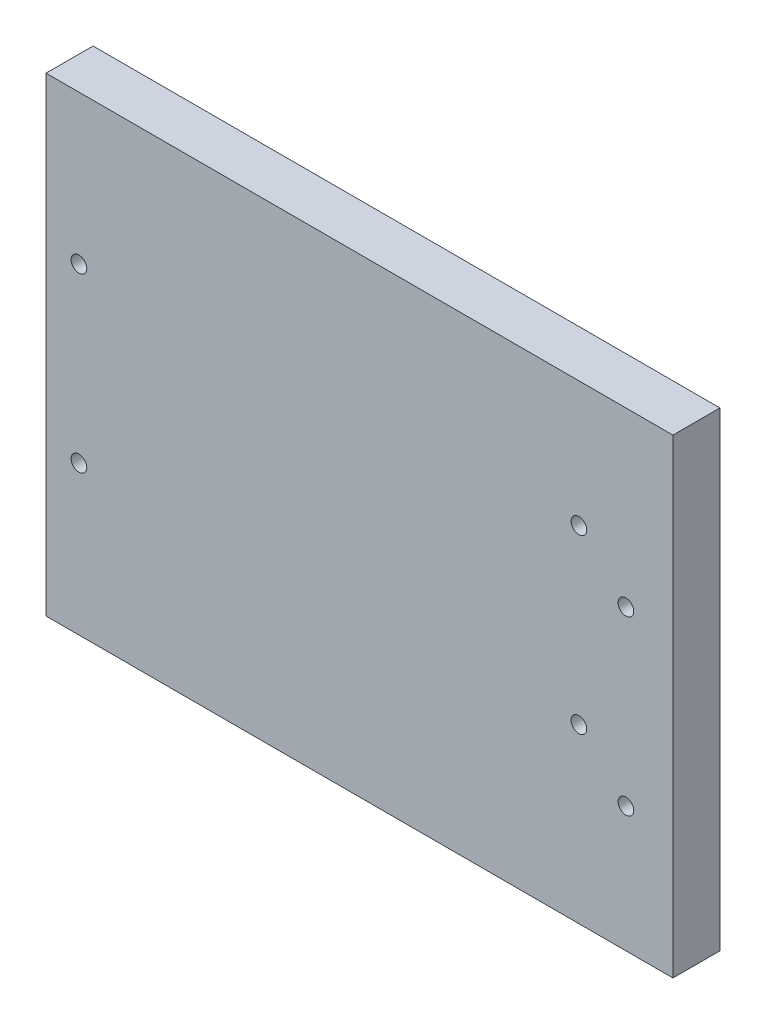
ISO-10303-21;
HEADER;
FILE_DESCRIPTION(('STEP AP214'),'2;1');
FILE_NAME('part.step','',(''),(''),'','','');
FILE_SCHEMA(('AUTOMOTIVE_DESIGN { 1 0 10303 214 1 1 1 1 }'));
ENDSEC;
DATA;
#1=APPLICATION_CONTEXT('core data for automotive mechanical design processes');
#2=APPLICATION_PROTOCOL_DEFINITION('international standard','automotive_design',2000,#1);
#3=PRODUCT_CONTEXT('',#1,'mechanical');
#4=PRODUCT('Part','Part','',(#3));
#5=PRODUCT_RELATED_PRODUCT_CATEGORY('part','',(#4));
#6=PRODUCT_DEFINITION_FORMATION('','',#4);
#7=PRODUCT_DEFINITION_CONTEXT('part definition',#1,'design');
#8=PRODUCT_DEFINITION('design','',#6,#7);
#9=PRODUCT_DEFINITION_SHAPE('','',#8);
#10=(LENGTH_UNIT() NAMED_UNIT(*) SI_UNIT(.MILLI.,.METRE.));
#11=(NAMED_UNIT(*) PLANE_ANGLE_UNIT() SI_UNIT($,.RADIAN.));
#12=(NAMED_UNIT(*) SI_UNIT($,.STERADIAN.) SOLID_ANGLE_UNIT());
#13=UNCERTAINTY_MEASURE_WITH_UNIT(LENGTH_MEASURE(1.E-05),#10,'distance_accuracy_value','');
#14=(GEOMETRIC_REPRESENTATION_CONTEXT(3) GLOBAL_UNCERTAINTY_ASSIGNED_CONTEXT((#13)) GLOBAL_UNIT_ASSIGNED_CONTEXT((#10,
#11,#12)) REPRESENTATION_CONTEXT('',''));
#15=CARTESIAN_POINT('',(0.,0.,0.));
#16=DIRECTION('',(0.,0.,1.));
#17=DIRECTION('',(1.,0.,0.));
#18=AXIS2_PLACEMENT_3D('',#15,#16,#17);
#19=CARTESIAN_POINT('',(-89.5,-27.5,0.));
#20=DIRECTION('',(0.,0.,1.));
#21=DIRECTION('',(1.,0.,0.));
#22=AXIS2_PLACEMENT_3D('',#19,#20,#21);
#23=CYLINDRICAL_SURFACE('',#22,2.50000000000001);
#24=CARTESIAN_POINT('',(-89.5,-27.5,15.));
#25=DIRECTION('',(0.,0.,1.));
#26=DIRECTION('',(1.,0.,0.));
#27=AXIS2_PLACEMENT_3D('',#24,#25,#26);
#28=CIRCLE('',#27,2.50000000000001);
#29=CARTESIAN_POINT('',(-87.,-27.5,15.));
#30=VERTEX_POINT('',#29);
#31=EDGE_CURVE('E154',#30,#30,#28,.T.);
#32=ORIENTED_EDGE('',*,*,#31,.T.);
#33=EDGE_LOOP('',(#32));
#34=FACE_BOUND('',#33,.T.);
#35=CARTESIAN_POINT('',(-89.5,-27.5,6.));
#36=DIRECTION('',(0.,0.,-1.));
#37=DIRECTION('',(-1.,0.,0.));
#38=AXIS2_PLACEMENT_3D('',#35,#36,#37);
#39=CIRCLE('',#38,2.50000000000001);
#40=CARTESIAN_POINT('',(-92.,-27.5,6.));
#41=VERTEX_POINT('',#40);
#42=EDGE_CURVE('E48',#41,#41,#39,.F.);
#43=ORIENTED_EDGE('',*,*,#42,.F.);
#44=EDGE_LOOP('',(#43));
#45=FACE_BOUND('',#44,.T.);
#46=ADVANCED_FACE('F44',(#34,#45),#23,.F.);
#47=CARTESIAN_POINT('',(-89.5,27.5,0.));
#48=DIRECTION('',(0.,0.,1.));
#49=DIRECTION('',(1.,0.,0.));
#50=AXIS2_PLACEMENT_3D('',#47,#48,#49);
#51=CYLINDRICAL_SURFACE('',#50,2.50000000000001);
#52=CARTESIAN_POINT('',(-89.5,27.5,15.));
#53=DIRECTION('',(0.,0.,1.));
#54=DIRECTION('',(1.,0.,0.));
#55=AXIS2_PLACEMENT_3D('',#52,#53,#54);
#56=CIRCLE('',#55,2.50000000000001);
#57=CARTESIAN_POINT('',(-87.,27.5,15.));
#58=VERTEX_POINT('',#57);
#59=EDGE_CURVE('E159',#58,#58,#56,.T.);
#60=ORIENTED_EDGE('',*,*,#59,.T.);
#61=EDGE_LOOP('',(#60));
#62=FACE_BOUND('',#61,.T.);
#63=CARTESIAN_POINT('',(-89.5,27.5,6.));
#64=DIRECTION('',(0.,0.,-1.));
#65=DIRECTION('',(-1.,0.,0.));
#66=AXIS2_PLACEMENT_3D('',#63,#64,#65);
#67=CIRCLE('',#66,2.50000000000001);
#68=CARTESIAN_POINT('',(-92.,27.5,6.));
#69=VERTEX_POINT('',#68);
#70=EDGE_CURVE('E147',#69,#69,#67,.F.);
#71=ORIENTED_EDGE('',*,*,#70,.F.);
#72=EDGE_LOOP('',(#71));
#73=FACE_BOUND('',#72,.T.);
#74=ADVANCED_FACE('F257',(#62,#73),#51,.F.);
#75=CARTESIAN_POINT('',(70.,35.,0.));
#76=DIRECTION('',(0.,0.,1.));
#77=DIRECTION('',(1.,0.,0.));
#78=AXIS2_PLACEMENT_3D('',#75,#76,#77);
#79=CYLINDRICAL_SURFACE('',#78,2.5);
#80=CARTESIAN_POINT('',(70.,35.,15.));
#81=DIRECTION('',(0.,0.,1.));
#82=DIRECTION('',(1.,0.,0.));
#83=AXIS2_PLACEMENT_3D('',#80,#81,#82);
#84=CIRCLE('',#83,2.5);
#85=CARTESIAN_POINT('',(72.5,35.,15.));
#86=VERTEX_POINT('',#85);
#87=EDGE_CURVE('E165',#86,#86,#84,.T.);
#88=ORIENTED_EDGE('',*,*,#87,.T.);
#89=EDGE_LOOP('',(#88));
#90=FACE_BOUND('',#89,.T.);
#91=CARTESIAN_POINT('',(70.,35.,6.));
#92=DIRECTION('',(0.,0.,-1.));
#93=DIRECTION('',(-1.,0.,0.));
#94=AXIS2_PLACEMENT_3D('',#91,#92,#93);
#95=CIRCLE('',#94,2.5);
#96=CARTESIAN_POINT('',(67.5,35.,6.));
#97=VERTEX_POINT('',#96);
#98=EDGE_CURVE('E144',#97,#97,#95,.F.);
#99=ORIENTED_EDGE('',*,*,#98,.F.);
#100=EDGE_LOOP('',(#99));
#101=FACE_BOUND('',#100,.T.);
#102=ADVANCED_FACE('F263',(#90,#101),#79,.F.);
#103=CARTESIAN_POINT('',(85.,20.,0.));
#104=DIRECTION('',(0.,0.,1.));
#105=DIRECTION('',(1.,0.,0.));
#106=AXIS2_PLACEMENT_3D('',#103,#104,#105);
#107=CYLINDRICAL_SURFACE('',#106,2.50000000000001);
#108=CARTESIAN_POINT('',(85.,20.,15.));
#109=DIRECTION('',(0.,0.,1.));
#110=DIRECTION('',(1.,0.,0.));
#111=AXIS2_PLACEMENT_3D('',#108,#109,#110);
#112=CIRCLE('',#111,2.50000000000001);
#113=CARTESIAN_POINT('',(87.5,20.,15.));
#114=VERTEX_POINT('',#113);
#115=EDGE_CURVE('E176',#114,#114,#112,.T.);
#116=ORIENTED_EDGE('',*,*,#115,.T.);
#117=EDGE_LOOP('',(#116));
#118=FACE_BOUND('',#117,.T.);
#119=CARTESIAN_POINT('',(85.,20.,6.));
#120=DIRECTION('',(0.,0.,-1.));
#121=DIRECTION('',(-1.,0.,0.));
#122=AXIS2_PLACEMENT_3D('',#119,#120,#121);
#123=CIRCLE('',#122,2.50000000000001);
#124=CARTESIAN_POINT('',(82.5,20.,6.));
#125=VERTEX_POINT('',#124);
#126=EDGE_CURVE('E140',#125,#125,#123,.F.);
#127=ORIENTED_EDGE('',*,*,#126,.F.);
#128=EDGE_LOOP('',(#127));
#129=FACE_BOUND('',#128,.T.);
#130=ADVANCED_FACE('F270',(#118,#129),#107,.F.);
#131=CARTESIAN_POINT('',(70.,-20.,0.));
#132=DIRECTION('',(0.,0.,1.));
#133=DIRECTION('',(1.,0.,0.));
#134=AXIS2_PLACEMENT_3D('',#131,#132,#133);
#135=CYLINDRICAL_SURFACE('',#134,2.5);
#136=CARTESIAN_POINT('',(70.,-20.,15.));
#137=DIRECTION('',(0.,0.,1.));
#138=DIRECTION('',(1.,0.,0.));
#139=AXIS2_PLACEMENT_3D('',#136,#137,#138);
#140=CIRCLE('',#139,2.5);
#141=CARTESIAN_POINT('',(72.5,-20.,15.));
#142=VERTEX_POINT('',#141);
#143=EDGE_CURVE('E172',#142,#142,#140,.T.);
#144=ORIENTED_EDGE('',*,*,#143,.T.);
#145=EDGE_LOOP('',(#144));
#146=FACE_BOUND('',#145,.T.);
#147=CARTESIAN_POINT('',(70.,-20.,6.));
#148=DIRECTION('',(0.,0.,-1.));
#149=DIRECTION('',(-1.,0.,0.));
#150=AXIS2_PLACEMENT_3D('',#147,#148,#149);
#151=CIRCLE('',#150,2.5);
#152=CARTESIAN_POINT('',(67.5,-20.,6.));
#153=VERTEX_POINT('',#152);
#154=EDGE_CURVE('E135',#153,#153,#151,.F.);
#155=ORIENTED_EDGE('',*,*,#154,.F.);
#156=EDGE_LOOP('',(#155));
#157=FACE_BOUND('',#156,.T.);
#158=ADVANCED_FACE('F273',(#146,#157),#135,.F.);
#159=CARTESIAN_POINT('',(85.,-35.,0.));
#160=DIRECTION('',(0.,0.,1.));
#161=DIRECTION('',(1.,0.,0.));
#162=AXIS2_PLACEMENT_3D('',#159,#160,#161);
#163=CYLINDRICAL_SURFACE('',#162,2.50000000000001);
#164=CARTESIAN_POINT('',(85.,-35.,15.));
#165=DIRECTION('',(0.,0.,1.));
#166=DIRECTION('',(1.,0.,0.));
#167=AXIS2_PLACEMENT_3D('',#164,#165,#166);
#168=CIRCLE('',#167,2.50000000000001);
#169=CARTESIAN_POINT('',(87.5,-35.,15.));
#170=VERTEX_POINT('',#169);
#171=EDGE_CURVE('E120',#170,#170,#168,.T.);
#172=ORIENTED_EDGE('',*,*,#171,.T.);
#173=EDGE_LOOP('',(#172));
#174=FACE_BOUND('',#173,.T.);
#175=CARTESIAN_POINT('',(85.,-35.,6.));
#176=DIRECTION('',(0.,0.,-1.));
#177=DIRECTION('',(-1.,0.,0.));
#178=AXIS2_PLACEMENT_3D('',#175,#176,#177);
#179=CIRCLE('',#178,2.50000000000001);
#180=CARTESIAN_POINT('',(82.5,-35.,6.));
#181=VERTEX_POINT('',#180);
#182=EDGE_CURVE('E131',#181,#181,#179,.F.);
#183=ORIENTED_EDGE('',*,*,#182,.F.);
#184=EDGE_LOOP('',(#183));
#185=FACE_BOUND('',#184,.T.);
#186=ADVANCED_FACE('F277',(#174,#185),#163,.F.);
#187=CARTESIAN_POINT('',(-100.,-75.,15.));
#188=DIRECTION('',(1.,0.,0.));
#189=DIRECTION('',(0.,0.,-1.));
#190=AXIS2_PLACEMENT_3D('',#187,#188,#189);
#191=PLANE('',#190);
#192=DIRECTION('',(0.,-1.,0.));
#193=VECTOR('',#192,1.);
#194=CARTESIAN_POINT('',(-100.,-75.,0.));
#195=LINE('',#194,#193);
#196=CARTESIAN_POINT('',(-100.,75.,0.));
#197=VERTEX_POINT('',#196);
#198=CARTESIAN_POINT('',(-100.,-75.,0.));
#199=VERTEX_POINT('',#198);
#200=EDGE_CURVE('E116',#197,#199,#195,.T.);
#201=ORIENTED_EDGE('',*,*,#200,.T.);
#202=DIRECTION('',(0.,0.,-1.));
#203=VECTOR('',#202,1.);
#204=CARTESIAN_POINT('',(-100.,-75.,15.));
#205=LINE('',#204,#203);
#206=CARTESIAN_POINT('',(-100.,-75.,15.));
#207=VERTEX_POINT('',#206);
#208=EDGE_CURVE('E11',#207,#199,#205,.T.);
#209=ORIENTED_EDGE('',*,*,#208,.F.);
#210=DIRECTION('',(0.,-1.,0.));
#211=VECTOR('',#210,1.);
#212=CARTESIAN_POINT('',(-100.,-75.,15.));
#213=LINE('',#212,#211);
#214=CARTESIAN_POINT('',(-100.,75.,15.));
#215=VERTEX_POINT('',#214);
#216=EDGE_CURVE('E99',#215,#207,#213,.T.);
#217=ORIENTED_EDGE('',*,*,#216,.F.);
#218=DIRECTION('',(0.,0.,-1.));
#219=VECTOR('',#218,1.);
#220=CARTESIAN_POINT('',(-100.,75.,15.));
#221=LINE('',#220,#219);
#222=EDGE_CURVE('E112',#215,#197,#221,.T.);
#223=ORIENTED_EDGE('',*,*,#222,.T.);
#224=EDGE_LOOP('',(#201,#209,#217,#223));
#225=FACE_BOUND('',#224,.T.);
#226=ADVANCED_FACE('F46',(#225),#191,.F.);
#227=CARTESIAN_POINT('',(100.,-75.,15.));
#228=DIRECTION('',(0.,1.,0.));
#229=DIRECTION('',(-1.,0.,0.));
#230=AXIS2_PLACEMENT_3D('',#227,#228,#229);
#231=PLANE('',#230);
#232=DIRECTION('',(1.,0.,0.));
#233=VECTOR('',#232,1.);
#234=CARTESIAN_POINT('',(100.,-75.,0.));
#235=LINE('',#234,#233);
#236=CARTESIAN_POINT('',(100.,-75.,0.));
#237=VERTEX_POINT('',#236);
#238=EDGE_CURVE('E104',#199,#237,#235,.T.);
#239=ORIENTED_EDGE('',*,*,#238,.T.);
#240=DIRECTION('',(0.,0.,-1.));
#241=VECTOR('',#240,1.);
#242=CARTESIAN_POINT('',(100.,-75.,15.));
#243=LINE('',#242,#241);
#244=CARTESIAN_POINT('',(100.,-75.,15.));
#245=VERTEX_POINT('',#244);
#246=EDGE_CURVE('E55',#245,#237,#243,.T.);
#247=ORIENTED_EDGE('',*,*,#246,.F.);
#248=DIRECTION('',(1.,0.,0.));
#249=VECTOR('',#248,1.);
#250=CARTESIAN_POINT('',(100.,-75.,15.));
#251=LINE('',#250,#249);
#252=EDGE_CURVE('E94',#207,#245,#251,.T.);
#253=ORIENTED_EDGE('',*,*,#252,.F.);
#254=ORIENTED_EDGE('',*,*,#208,.T.);
#255=EDGE_LOOP('',(#239,#247,#253,#254));
#256=FACE_BOUND('',#255,.T.);
#257=ADVANCED_FACE('F103',(#256),#231,.F.);
#258=CARTESIAN_POINT('',(100.,-75.,15.));
#259=DIRECTION('',(-1.,0.,0.));
#260=DIRECTION('',(0.,0.,1.));
#261=AXIS2_PLACEMENT_3D('',#258,#259,#260);
#262=PLANE('',#261);
#263=DIRECTION('',(0.,1.,0.));
#264=VECTOR('',#263,1.);
#265=CARTESIAN_POINT('',(100.,-75.,0.));
#266=LINE('',#265,#264);
#267=CARTESIAN_POINT('',(100.,75.,0.));
#268=VERTEX_POINT('',#267);
#269=EDGE_CURVE('E81',#237,#268,#266,.T.);
#270=ORIENTED_EDGE('',*,*,#269,.T.);
#271=DIRECTION('',(0.,0.,-1.));
#272=VECTOR('',#271,1.);
#273=CARTESIAN_POINT('',(100.,75.,15.));
#274=LINE('',#273,#272);
#275=CARTESIAN_POINT('',(100.,75.,15.));
#276=VERTEX_POINT('',#275);
#277=EDGE_CURVE('E106',#276,#268,#274,.T.);
#278=ORIENTED_EDGE('',*,*,#277,.F.);
#279=DIRECTION('',(0.,1.,0.));
#280=VECTOR('',#279,1.);
#281=CARTESIAN_POINT('',(100.,-75.,15.));
#282=LINE('',#281,#280);
#283=EDGE_CURVE('E97',#245,#276,#282,.T.);
#284=ORIENTED_EDGE('',*,*,#283,.F.);
#285=ORIENTED_EDGE('',*,*,#246,.T.);
#286=EDGE_LOOP('',(#270,#278,#284,#285));
#287=FACE_BOUND('',#286,.T.);
#288=ADVANCED_FACE('F108',(#287),#262,.F.);
#289=CARTESIAN_POINT('',(100.,75.,15.));
#290=DIRECTION('',(0.,-1.,0.));
#291=DIRECTION('',(1.,0.,0.));
#292=AXIS2_PLACEMENT_3D('',#289,#290,#291);
#293=PLANE('',#292);
#294=DIRECTION('',(-1.,0.,0.));
#295=VECTOR('',#294,1.);
#296=CARTESIAN_POINT('',(100.,75.,0.));
#297=LINE('',#296,#295);
#298=EDGE_CURVE('E87',#268,#197,#297,.T.);
#299=ORIENTED_EDGE('',*,*,#298,.T.);
#300=ORIENTED_EDGE('',*,*,#222,.F.);
#301=DIRECTION('',(-1.,0.,0.));
#302=VECTOR('',#301,1.);
#303=CARTESIAN_POINT('',(100.,75.,15.));
#304=LINE('',#303,#302);
#305=EDGE_CURVE('E64',#276,#215,#304,.T.);
#306=ORIENTED_EDGE('',*,*,#305,.F.);
#307=ORIENTED_EDGE('',*,*,#277,.T.);
#308=EDGE_LOOP('',(#299,#300,#306,#307));
#309=FACE_BOUND('',#308,.T.);
#310=ADVANCED_FACE('F245',(#309),#293,.F.);
#311=CARTESIAN_POINT('',(0.,0.,15.));
#312=DIRECTION('',(0.,0.,1.));
#313=DIRECTION('',(1.,0.,0.));
#314=AXIS2_PLACEMENT_3D('',#311,#312,#313);
#315=PLANE('',#314);
#316=ORIENTED_EDGE('',*,*,#171,.F.);
#317=EDGE_LOOP('',(#316));
#318=FACE_BOUND('',#317,.T.);
#319=ORIENTED_EDGE('',*,*,#143,.F.);
#320=EDGE_LOOP('',(#319));
#321=FACE_BOUND('',#320,.T.);
#322=ORIENTED_EDGE('',*,*,#115,.F.);
#323=EDGE_LOOP('',(#322));
#324=FACE_BOUND('',#323,.T.);
#325=ORIENTED_EDGE('',*,*,#87,.F.);
#326=EDGE_LOOP('',(#325));
#327=FACE_BOUND('',#326,.T.);
#328=ORIENTED_EDGE('',*,*,#59,.F.);
#329=EDGE_LOOP('',(#328));
#330=FACE_BOUND('',#329,.T.);
#331=ORIENTED_EDGE('',*,*,#31,.F.);
#332=EDGE_LOOP('',(#331));
#333=FACE_BOUND('',#332,.T.);
#334=ORIENTED_EDGE('',*,*,#216,.T.);
#335=ORIENTED_EDGE('',*,*,#252,.T.);
#336=ORIENTED_EDGE('',*,*,#283,.T.);
#337=ORIENTED_EDGE('',*,*,#305,.T.);
#338=EDGE_LOOP('',(#334,#335,#336,#337));
#339=FACE_BOUND('',#338,.T.);
#340=ADVANCED_FACE('F95',(#318,#321,#324,#327,#330,#333,#339),#315,.T.);
#341=CARTESIAN_POINT('',(0.,0.,0.));
#342=DIRECTION('',(0.,0.,1.));
#343=DIRECTION('',(1.,0.,0.));
#344=AXIS2_PLACEMENT_3D('',#341,#342,#343);
#345=PLANE('',#344);
#346=CARTESIAN_POINT('',(-89.5,-27.5,0.));
#347=DIRECTION('',(0.,0.,-1.));
#348=DIRECTION('',(-1.,0.,0.));
#349=AXIS2_PLACEMENT_3D('',#346,#347,#348);
#350=CIRCLE('',#349,5.);
#351=CARTESIAN_POINT('',(-94.5,-27.5,0.));
#352=VERTEX_POINT('',#351);
#353=EDGE_CURVE('E213',#352,#352,#350,.T.);
#354=ORIENTED_EDGE('',*,*,#353,.F.);
#355=EDGE_LOOP('',(#354));
#356=FACE_BOUND('',#355,.T.);
#357=CARTESIAN_POINT('',(85.,-35.,0.));
#358=DIRECTION('',(0.,0.,-1.));
#359=DIRECTION('',(-1.,0.,0.));
#360=AXIS2_PLACEMENT_3D('',#357,#358,#359);
#361=CIRCLE('',#360,5.00000000000001);
#362=CARTESIAN_POINT('',(80.,-35.,0.));
#363=VERTEX_POINT('',#362);
#364=EDGE_CURVE('E198',#363,#363,#361,.T.);
#365=ORIENTED_EDGE('',*,*,#364,.F.);
#366=EDGE_LOOP('',(#365));
#367=FACE_BOUND('',#366,.T.);
#368=CARTESIAN_POINT('',(85.,20.,0.));
#369=DIRECTION('',(0.,0.,-1.));
#370=DIRECTION('',(-1.,0.,0.));
#371=AXIS2_PLACEMENT_3D('',#368,#369,#370);
#372=CIRCLE('',#371,5.);
#373=CARTESIAN_POINT('',(80.,20.,0.));
#374=VERTEX_POINT('',#373);
#375=EDGE_CURVE('E197',#374,#374,#372,.T.);
#376=ORIENTED_EDGE('',*,*,#375,.F.);
#377=EDGE_LOOP('',(#376));
#378=FACE_BOUND('',#377,.T.);
#379=CARTESIAN_POINT('',(70.,-20.,0.));
#380=DIRECTION('',(0.,0.,-1.));
#381=DIRECTION('',(-1.,0.,0.));
#382=AXIS2_PLACEMENT_3D('',#379,#380,#381);
#383=CIRCLE('',#382,5.);
#384=CARTESIAN_POINT('',(65.,-20.,0.));
#385=VERTEX_POINT('',#384);
#386=EDGE_CURVE('E189',#385,#385,#383,.T.);
#387=ORIENTED_EDGE('',*,*,#386,.F.);
#388=EDGE_LOOP('',(#387));
#389=FACE_BOUND('',#388,.T.);
#390=CARTESIAN_POINT('',(-89.5,27.5,0.));
#391=DIRECTION('',(0.,0.,-1.));
#392=DIRECTION('',(-1.,0.,0.));
#393=AXIS2_PLACEMENT_3D('',#390,#391,#392);
#394=CIRCLE('',#393,5.);
#395=CARTESIAN_POINT('',(-94.5,27.5,0.));
#396=VERTEX_POINT('',#395);
#397=EDGE_CURVE('E214',#396,#396,#394,.T.);
#398=ORIENTED_EDGE('',*,*,#397,.F.);
#399=EDGE_LOOP('',(#398));
#400=FACE_BOUND('',#399,.T.);
#401=CARTESIAN_POINT('',(70.,35.,0.));
#402=DIRECTION('',(0.,0.,-1.));
#403=DIRECTION('',(-1.,0.,0.));
#404=AXIS2_PLACEMENT_3D('',#401,#402,#403);
#405=CIRCLE('',#404,4.99999999999999);
#406=CARTESIAN_POINT('',(65.,35.,0.));
#407=VERTEX_POINT('',#406);
#408=EDGE_CURVE('E185',#407,#407,#405,.T.);
#409=ORIENTED_EDGE('',*,*,#408,.F.);
#410=EDGE_LOOP('',(#409));
#411=FACE_BOUND('',#410,.T.);
#412=ORIENTED_EDGE('',*,*,#200,.F.);
#413=ORIENTED_EDGE('',*,*,#298,.F.);
#414=ORIENTED_EDGE('',*,*,#269,.F.);
#415=ORIENTED_EDGE('',*,*,#238,.F.);
#416=EDGE_LOOP('',(#412,#413,#414,#415));
#417=FACE_BOUND('',#416,.T.);
#418=ADVANCED_FACE('F235',(#356,#367,#378,#389,#400,#411,#417),#345,.F.);
#419=CARTESIAN_POINT('',(85.,-35.,6.));
#420=DIRECTION('',(0.,0.,-1.));
#421=DIRECTION('',(-1.,0.,0.));
#422=AXIS2_PLACEMENT_3D('',#419,#420,#421);
#423=PLANE('',#422);
#424=CARTESIAN_POINT('',(85.,-35.,6.));
#425=DIRECTION('',(0.,0.,-1.));
#426=DIRECTION('',(-1.,0.,0.));
#427=AXIS2_PLACEMENT_3D('',#424,#425,#426);
#428=CIRCLE('',#427,5.00000000000001);
#429=CARTESIAN_POINT('',(80.,-35.,6.));
#430=VERTEX_POINT('',#429);
#431=EDGE_CURVE('E218',#430,#430,#428,.T.);
#432=ORIENTED_EDGE('',*,*,#431,.T.);
#433=EDGE_LOOP('',(#432));
#434=FACE_BOUND('',#433,.T.);
#435=ORIENTED_EDGE('',*,*,#182,.T.);
#436=EDGE_LOOP('',(#435));
#437=FACE_BOUND('',#436,.T.);
#438=ADVANCED_FACE('F238',(#434,#437),#423,.T.);
#439=CARTESIAN_POINT('',(85.,-35.,6.));
#440=DIRECTION('',(0.,0.,-1.));
#441=DIRECTION('',(-1.,0.,0.));
#442=AXIS2_PLACEMENT_3D('',#439,#440,#441);
#443=CYLINDRICAL_SURFACE('',#442,5.00000000000001);
#444=ORIENTED_EDGE('',*,*,#431,.F.);
#445=EDGE_LOOP('',(#444));
#446=FACE_BOUND('',#445,.T.);
#447=ORIENTED_EDGE('',*,*,#364,.T.);
#448=EDGE_LOOP('',(#447));
#449=FACE_BOUND('',#448,.T.);
#450=ADVANCED_FACE('F303',(#446,#449),#443,.F.);
#451=CARTESIAN_POINT('',(70.,-20.,6.));
#452=DIRECTION('',(0.,0.,-1.));
#453=DIRECTION('',(-1.,0.,0.));
#454=AXIS2_PLACEMENT_3D('',#451,#452,#453);
#455=PLANE('',#454);
#456=CARTESIAN_POINT('',(70.,-20.,6.));
#457=DIRECTION('',(0.,0.,-1.));
#458=DIRECTION('',(-1.,0.,0.));
#459=AXIS2_PLACEMENT_3D('',#456,#457,#458);
#460=CIRCLE('',#459,5.);
#461=CARTESIAN_POINT('',(65.,-20.,6.));
#462=VERTEX_POINT('',#461);
#463=EDGE_CURVE('E202',#462,#462,#460,.T.);
#464=ORIENTED_EDGE('',*,*,#463,.T.);
#465=EDGE_LOOP('',(#464));
#466=FACE_BOUND('',#465,.T.);
#467=ORIENTED_EDGE('',*,*,#154,.T.);
#468=EDGE_LOOP('',(#467));
#469=FACE_BOUND('',#468,.T.);
#470=ADVANCED_FACE('F300',(#466,#469),#455,.T.);
#471=CARTESIAN_POINT('',(70.,-20.,6.));
#472=DIRECTION('',(0.,0.,-1.));
#473=DIRECTION('',(-1.,0.,0.));
#474=AXIS2_PLACEMENT_3D('',#471,#472,#473);
#475=CYLINDRICAL_SURFACE('',#474,5.);
#476=ORIENTED_EDGE('',*,*,#463,.F.);
#477=EDGE_LOOP('',(#476));
#478=FACE_BOUND('',#477,.T.);
#479=ORIENTED_EDGE('',*,*,#386,.T.);
#480=EDGE_LOOP('',(#479));
#481=FACE_BOUND('',#480,.T.);
#482=ADVANCED_FACE('F295',(#478,#481),#475,.F.);
#483=CARTESIAN_POINT('',(85.,20.,6.));
#484=DIRECTION('',(0.,0.,-1.));
#485=DIRECTION('',(-1.,0.,0.));
#486=AXIS2_PLACEMENT_3D('',#483,#484,#485);
#487=PLANE('',#486);
#488=CARTESIAN_POINT('',(85.,20.,6.));
#489=DIRECTION('',(0.,0.,-1.));
#490=DIRECTION('',(-1.,0.,0.));
#491=AXIS2_PLACEMENT_3D('',#488,#489,#490);
#492=CIRCLE('',#491,5.);
#493=CARTESIAN_POINT('',(80.,20.,6.));
#494=VERTEX_POINT('',#493);
#495=EDGE_CURVE('E193',#494,#494,#492,.T.);
#496=ORIENTED_EDGE('',*,*,#495,.T.);
#497=EDGE_LOOP('',(#496));
#498=FACE_BOUND('',#497,.T.);
#499=ORIENTED_EDGE('',*,*,#126,.T.);
#500=EDGE_LOOP('',(#499));
#501=FACE_BOUND('',#500,.T.);
#502=ADVANCED_FACE('F292',(#498,#501),#487,.T.);
#503=CARTESIAN_POINT('',(85.,20.,6.));
#504=DIRECTION('',(0.,0.,-1.));
#505=DIRECTION('',(-1.,0.,0.));
#506=AXIS2_PLACEMENT_3D('',#503,#504,#505);
#507=CYLINDRICAL_SURFACE('',#506,5.);
#508=ORIENTED_EDGE('',*,*,#495,.F.);
#509=EDGE_LOOP('',(#508));
#510=FACE_BOUND('',#509,.T.);
#511=ORIENTED_EDGE('',*,*,#375,.T.);
#512=EDGE_LOOP('',(#511));
#513=FACE_BOUND('',#512,.T.);
#514=ADVANCED_FACE('F290',(#510,#513),#507,.F.);
#515=CARTESIAN_POINT('',(70.,35.,6.));
#516=DIRECTION('',(0.,0.,-1.));
#517=DIRECTION('',(-1.,0.,0.));
#518=AXIS2_PLACEMENT_3D('',#515,#516,#517);
#519=PLANE('',#518);
#520=CARTESIAN_POINT('',(70.,35.,6.));
#521=DIRECTION('',(0.,0.,-1.));
#522=DIRECTION('',(-1.,0.,0.));
#523=AXIS2_PLACEMENT_3D('',#520,#521,#522);
#524=CIRCLE('',#523,4.99999999999999);
#525=CARTESIAN_POINT('',(65.,35.,6.));
#526=VERTEX_POINT('',#525);
#527=EDGE_CURVE('E136',#526,#526,#524,.T.);
#528=ORIENTED_EDGE('',*,*,#527,.T.);
#529=EDGE_LOOP('',(#528));
#530=FACE_BOUND('',#529,.T.);
#531=ORIENTED_EDGE('',*,*,#98,.T.);
#532=EDGE_LOOP('',(#531));
#533=FACE_BOUND('',#532,.T.);
#534=ADVANCED_FACE('F286',(#530,#533),#519,.T.);
#535=CARTESIAN_POINT('',(70.,35.,6.));
#536=DIRECTION('',(0.,0.,-1.));
#537=DIRECTION('',(-1.,0.,0.));
#538=AXIS2_PLACEMENT_3D('',#535,#536,#537);
#539=CYLINDRICAL_SURFACE('',#538,4.99999999999999);
#540=ORIENTED_EDGE('',*,*,#527,.F.);
#541=EDGE_LOOP('',(#540));
#542=FACE_BOUND('',#541,.T.);
#543=ORIENTED_EDGE('',*,*,#408,.T.);
#544=EDGE_LOOP('',(#543));
#545=FACE_BOUND('',#544,.T.);
#546=ADVANCED_FACE('F282',(#542,#545),#539,.F.);
#547=CARTESIAN_POINT('',(-89.5,27.5,6.));
#548=DIRECTION('',(0.,0.,-1.));
#549=DIRECTION('',(-1.,0.,0.));
#550=AXIS2_PLACEMENT_3D('',#547,#548,#549);
#551=PLANE('',#550);
#552=CARTESIAN_POINT('',(-89.5,27.5,6.));
#553=DIRECTION('',(0.,0.,-1.));
#554=DIRECTION('',(-1.,0.,0.));
#555=AXIS2_PLACEMENT_3D('',#552,#553,#554);
#556=CIRCLE('',#555,5.);
#557=CARTESIAN_POINT('',(-94.5,27.5,6.));
#558=VERTEX_POINT('',#557);
#559=EDGE_CURVE('E225',#558,#558,#556,.T.);
#560=ORIENTED_EDGE('',*,*,#559,.T.);
#561=EDGE_LOOP('',(#560));
#562=FACE_BOUND('',#561,.T.);
#563=ORIENTED_EDGE('',*,*,#70,.T.);
#564=EDGE_LOOP('',(#563));
#565=FACE_BOUND('',#564,.T.);
#566=ADVANCED_FACE('F285',(#562,#565),#551,.T.);
#567=CARTESIAN_POINT('',(-89.5,27.5,6.));
#568=DIRECTION('',(0.,0.,-1.));
#569=DIRECTION('',(-1.,0.,0.));
#570=AXIS2_PLACEMENT_3D('',#567,#568,#569);
#571=CYLINDRICAL_SURFACE('',#570,5.);
#572=ORIENTED_EDGE('',*,*,#559,.F.);
#573=EDGE_LOOP('',(#572));
#574=FACE_BOUND('',#573,.T.);
#575=ORIENTED_EDGE('',*,*,#397,.T.);
#576=EDGE_LOOP('',(#575));
#577=FACE_BOUND('',#576,.T.);
#578=ADVANCED_FACE('F233',(#574,#577),#571,.F.);
#579=CARTESIAN_POINT('',(-89.5,-27.5,6.));
#580=DIRECTION('',(0.,0.,-1.));
#581=DIRECTION('',(-1.,0.,0.));
#582=AXIS2_PLACEMENT_3D('',#579,#580,#581);
#583=PLANE('',#582);
#584=CARTESIAN_POINT('',(-89.5,-27.5,6.));
#585=DIRECTION('',(0.,0.,-1.));
#586=DIRECTION('',(-1.,0.,0.));
#587=AXIS2_PLACEMENT_3D('',#584,#585,#586);
#588=CIRCLE('',#587,5.);
#589=CARTESIAN_POINT('',(-94.5,-27.5,6.));
#590=VERTEX_POINT('',#589);
#591=EDGE_CURVE('E209',#590,#590,#588,.T.);
#592=ORIENTED_EDGE('',*,*,#591,.T.);
#593=EDGE_LOOP('',(#592));
#594=FACE_BOUND('',#593,.T.);
#595=ORIENTED_EDGE('',*,*,#42,.T.);
#596=EDGE_LOOP('',(#595));
#597=FACE_BOUND('',#596,.T.);
#598=ADVANCED_FACE('F308',(#594,#597),#583,.T.);
#599=CARTESIAN_POINT('',(-89.5,-27.5,6.));
#600=DIRECTION('',(0.,0.,-1.));
#601=DIRECTION('',(-1.,0.,0.));
#602=AXIS2_PLACEMENT_3D('',#599,#600,#601);
#603=CYLINDRICAL_SURFACE('',#602,5.);
#604=ORIENTED_EDGE('',*,*,#591,.F.);
#605=EDGE_LOOP('',(#604));
#606=FACE_BOUND('',#605,.T.);
#607=ORIENTED_EDGE('',*,*,#353,.T.);
#608=EDGE_LOOP('',(#607));
#609=FACE_BOUND('',#608,.T.);
#610=ADVANCED_FACE('F311',(#606,#609),#603,.F.);
#611=CLOSED_SHELL('',(#46,#74,#102,#130,#158,#186,#226,#257,#288,#310,#340,#418,#438,#450,#470,
#482,#502,#514,#534,#546,#566,#578,#598,#610));
#612=MANIFOLD_SOLID_BREP('B2',#611);
#613=ADVANCED_BREP_SHAPE_REPRESENTATION('',(#18,#612),#14);
#614=SHAPE_DEFINITION_REPRESENTATION(#9,#613);
ENDSEC;
END-ISO-10303-21;
